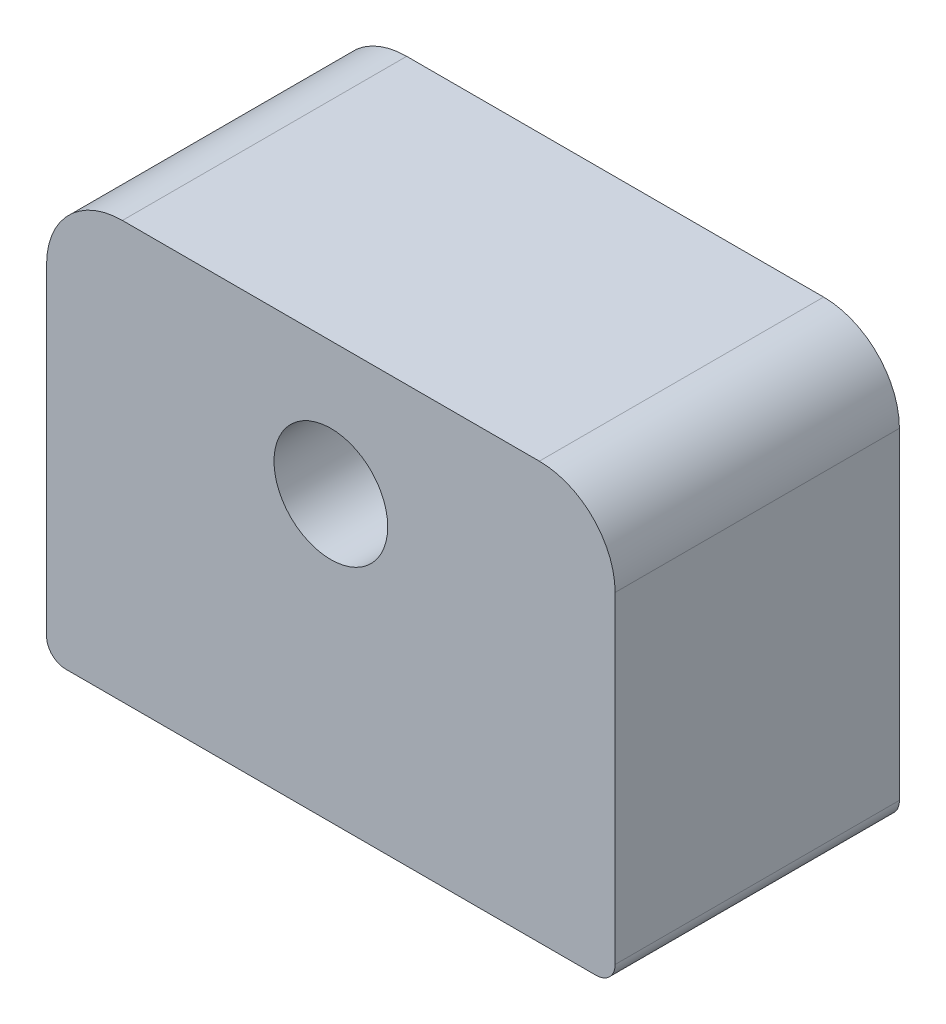
ISO-10303-21;
HEADER;
FILE_DESCRIPTION(('STEP AP214'),'2;1');
FILE_NAME('part.step','',(''),(''),'','','');
FILE_SCHEMA(('AUTOMOTIVE_DESIGN { 1 0 10303 214 1 1 1 1 }'));
ENDSEC;
DATA;
#1=APPLICATION_CONTEXT('core data for automotive mechanical design processes');
#2=APPLICATION_PROTOCOL_DEFINITION('international standard','automotive_design',2000,#1);
#3=PRODUCT_CONTEXT('',#1,'mechanical');
#4=PRODUCT('Part','Part','',(#3));
#5=PRODUCT_RELATED_PRODUCT_CATEGORY('part','',(#4));
#6=PRODUCT_DEFINITION_FORMATION('','',#4);
#7=PRODUCT_DEFINITION_CONTEXT('part definition',#1,'design');
#8=PRODUCT_DEFINITION('design','',#6,#7);
#9=PRODUCT_DEFINITION_SHAPE('','',#8);
#10=(LENGTH_UNIT() NAMED_UNIT(*) SI_UNIT(.MILLI.,.METRE.));
#11=(NAMED_UNIT(*) PLANE_ANGLE_UNIT() SI_UNIT($,.RADIAN.));
#12=(NAMED_UNIT(*) SI_UNIT($,.STERADIAN.) SOLID_ANGLE_UNIT());
#13=UNCERTAINTY_MEASURE_WITH_UNIT(LENGTH_MEASURE(1.E-05),#10,'distance_accuracy_value','');
#14=(GEOMETRIC_REPRESENTATION_CONTEXT(3) GLOBAL_UNCERTAINTY_ASSIGNED_CONTEXT((#13)) GLOBAL_UNIT_ASSIGNED_CONTEXT((#10,
#11,#12)) REPRESENTATION_CONTEXT('',''));
#15=CARTESIAN_POINT('',(0.,0.,0.));
#16=DIRECTION('',(0.,0.,1.));
#17=DIRECTION('',(1.,0.,0.));
#18=AXIS2_PLACEMENT_3D('',#15,#16,#17);
#19=CARTESIAN_POINT('',(-7.5,5.5,7.5));
#20=DIRECTION('',(1.,0.,0.));
#21=DIRECTION('',(0.,0.,-1.));
#22=AXIS2_PLACEMENT_3D('',#19,#20,#21);
#23=PLANE('',#22);
#24=DIRECTION('',(0.,-1.,0.));
#25=VECTOR('',#24,1.);
#26=CARTESIAN_POINT('',(-7.5,5.5,0.));
#27=LINE('',#26,#25);
#28=CARTESIAN_POINT('',(-7.5,3.5,0.));
#29=VERTEX_POINT('',#28);
#30=CARTESIAN_POINT('',(-7.5,-5.,0.));
#31=VERTEX_POINT('',#30);
#32=EDGE_CURVE('E169',#29,#31,#27,.T.);
#33=ORIENTED_EDGE('',*,*,#32,.T.);
#34=DIRECTION('',(0.,0.,-1.));
#35=VECTOR('',#34,1.);
#36=CARTESIAN_POINT('',(-7.5,-5.,7.5));
#37=LINE('',#36,#35);
#38=CARTESIAN_POINT('',(-7.5,-5.,7.5));
#39=VERTEX_POINT('',#38);
#40=EDGE_CURVE('E11',#31,#39,#37,.F.);
#41=ORIENTED_EDGE('',*,*,#40,.T.);
#42=DIRECTION('',(0.,-1.,0.));
#43=VECTOR('',#42,1.);
#44=CARTESIAN_POINT('',(-7.5,5.5,7.5));
#45=LINE('',#44,#43);
#46=CARTESIAN_POINT('',(-7.5,3.5,7.5));
#47=VERTEX_POINT('',#46);
#48=EDGE_CURVE('E124',#47,#39,#45,.T.);
#49=ORIENTED_EDGE('',*,*,#48,.F.);
#50=DIRECTION('',(0.,0.,-1.));
#51=VECTOR('',#50,1.);
#52=CARTESIAN_POINT('',(-7.5,3.5,7.5));
#53=LINE('',#52,#51);
#54=EDGE_CURVE('E140',#47,#29,#53,.T.);
#55=ORIENTED_EDGE('',*,*,#54,.T.);
#56=EDGE_LOOP('',(#33,#41,#49,#55));
#57=FACE_BOUND('',#56,.T.);
#58=ADVANCED_FACE('F32',(#57),#23,.F.);
#59=CARTESIAN_POINT('',(-7.5,-5.5,7.5));
#60=DIRECTION('',(0.,1.,0.));
#61=DIRECTION('',(0.,0.,1.));
#62=AXIS2_PLACEMENT_3D('',#59,#60,#61);
#63=PLANE('',#62);
#64=DIRECTION('',(1.,0.,0.));
#65=VECTOR('',#64,1.);
#66=CARTESIAN_POINT('',(-7.5,-5.5,0.));
#67=LINE('',#66,#65);
#68=CARTESIAN_POINT('',(-7.,-5.5,0.));
#69=VERTEX_POINT('',#68);
#70=CARTESIAN_POINT('',(7.,-5.5,0.));
#71=VERTEX_POINT('',#70);
#72=EDGE_CURVE('E129',#69,#71,#67,.T.);
#73=ORIENTED_EDGE('',*,*,#72,.T.);
#74=DIRECTION('',(0.,0.,-1.));
#75=VECTOR('',#74,1.);
#76=CARTESIAN_POINT('',(7.,-5.5,7.5));
#77=LINE('',#76,#75);
#78=CARTESIAN_POINT('',(7.,-5.5,7.5));
#79=VERTEX_POINT('',#78);
#80=EDGE_CURVE('E53',#71,#79,#77,.F.);
#81=ORIENTED_EDGE('',*,*,#80,.T.);
#82=DIRECTION('',(1.,0.,0.));
#83=VECTOR('',#82,1.);
#84=CARTESIAN_POINT('',(-7.5,-5.5,7.5));
#85=LINE('',#84,#83);
#86=CARTESIAN_POINT('',(-7.,-5.5,7.5));
#87=VERTEX_POINT('',#86);
#88=EDGE_CURVE('E127',#87,#79,#85,.T.);
#89=ORIENTED_EDGE('',*,*,#88,.F.);
#90=DIRECTION('',(0.,0.,-1.));
#91=VECTOR('',#90,1.);
#92=CARTESIAN_POINT('',(-7.,-5.5,7.5));
#93=LINE('',#92,#91);
#94=EDGE_CURVE('E150',#87,#69,#93,.T.);
#95=ORIENTED_EDGE('',*,*,#94,.T.);
#96=EDGE_LOOP('',(#73,#81,#89,#95));
#97=FACE_BOUND('',#96,.T.);
#98=ADVANCED_FACE('F167',(#97),#63,.F.);
#99=CARTESIAN_POINT('',(7.5,5.5,7.5));
#100=DIRECTION('',(-1.,0.,0.));
#101=DIRECTION('',(0.,0.,1.));
#102=AXIS2_PLACEMENT_3D('',#99,#100,#101);
#103=PLANE('',#102);
#104=DIRECTION('',(0.,1.,0.));
#105=VECTOR('',#104,1.);
#106=CARTESIAN_POINT('',(7.5,5.5,7.5));
#107=LINE('',#106,#105);
#108=CARTESIAN_POINT('',(7.5,-5.,7.5));
#109=VERTEX_POINT('',#108);
#110=CARTESIAN_POINT('',(7.5,3.5,7.5));
#111=VERTEX_POINT('',#110);
#112=EDGE_CURVE('E159',#109,#111,#107,.T.);
#113=ORIENTED_EDGE('',*,*,#112,.F.);
#114=DIRECTION('',(0.,0.,-1.));
#115=VECTOR('',#114,1.);
#116=CARTESIAN_POINT('',(7.5,-5.,7.5));
#117=LINE('',#116,#115);
#118=CARTESIAN_POINT('',(7.5,-5.,0.));
#119=VERTEX_POINT('',#118);
#120=EDGE_CURVE('E143',#109,#119,#117,.T.);
#121=ORIENTED_EDGE('',*,*,#120,.T.);
#122=DIRECTION('',(0.,1.,0.));
#123=VECTOR('',#122,1.);
#124=CARTESIAN_POINT('',(7.5,5.5,0.));
#125=LINE('',#124,#123);
#126=CARTESIAN_POINT('',(7.5,3.5,0.));
#127=VERTEX_POINT('',#126);
#128=EDGE_CURVE('E125',#119,#127,#125,.T.);
#129=ORIENTED_EDGE('',*,*,#128,.T.);
#130=DIRECTION('',(0.,0.,-1.));
#131=VECTOR('',#130,1.);
#132=CARTESIAN_POINT('',(7.5,3.5,7.5));
#133=LINE('',#132,#131);
#134=EDGE_CURVE('E106',#127,#111,#133,.F.);
#135=ORIENTED_EDGE('',*,*,#134,.T.);
#136=EDGE_LOOP('',(#113,#121,#129,#135));
#137=FACE_BOUND('',#136,.T.);
#138=ADVANCED_FACE('F163',(#137),#103,.F.);
#139=CARTESIAN_POINT('',(-7.5,5.5,7.5));
#140=DIRECTION('',(0.,-1.,0.));
#141=DIRECTION('',(0.,0.,-1.));
#142=AXIS2_PLACEMENT_3D('',#139,#140,#141);
#143=PLANE('',#142);
#144=DIRECTION('',(-1.,0.,0.));
#145=VECTOR('',#144,1.);
#146=CARTESIAN_POINT('',(-7.5,5.5,7.5));
#147=LINE('',#146,#145);
#148=CARTESIAN_POINT('',(5.5,5.5,7.5));
#149=VERTEX_POINT('',#148);
#150=CARTESIAN_POINT('',(-5.5,5.5,7.5));
#151=VERTEX_POINT('',#150);
#152=EDGE_CURVE('E119',#149,#151,#147,.T.);
#153=ORIENTED_EDGE('',*,*,#152,.F.);
#154=DIRECTION('',(0.,0.,-1.));
#155=VECTOR('',#154,1.);
#156=CARTESIAN_POINT('',(5.5,5.5,7.5));
#157=LINE('',#156,#155);
#158=CARTESIAN_POINT('',(5.5,5.5,0.));
#159=VERTEX_POINT('',#158);
#160=EDGE_CURVE('E104',#149,#159,#157,.T.);
#161=ORIENTED_EDGE('',*,*,#160,.T.);
#162=DIRECTION('',(-1.,0.,0.));
#163=VECTOR('',#162,1.);
#164=CARTESIAN_POINT('',(-7.5,5.5,0.));
#165=LINE('',#164,#163);
#166=CARTESIAN_POINT('',(-5.5,5.5,0.));
#167=VERTEX_POINT('',#166);
#168=EDGE_CURVE('E116',#159,#167,#165,.T.);
#169=ORIENTED_EDGE('',*,*,#168,.T.);
#170=DIRECTION('',(0.,0.,-1.));
#171=VECTOR('',#170,1.);
#172=CARTESIAN_POINT('',(-5.5,5.5,7.5));
#173=LINE('',#172,#171);
#174=EDGE_CURVE('E120',#167,#151,#173,.F.);
#175=ORIENTED_EDGE('',*,*,#174,.T.);
#176=EDGE_LOOP('',(#153,#161,#169,#175));
#177=FACE_BOUND('',#176,.T.);
#178=ADVANCED_FACE('F115',(#177),#143,.F.);
#179=CARTESIAN_POINT('',(0.,0.,7.5));
#180=DIRECTION('',(0.,0.,1.));
#181=DIRECTION('',(1.,0.,0.));
#182=AXIS2_PLACEMENT_3D('',#179,#180,#181);
#183=PLANE('',#182);
#184=CARTESIAN_POINT('',(0.,2.,7.5));
#185=DIRECTION('',(0.,0.,1.));
#186=DIRECTION('',(1.,0.,0.));
#187=AXIS2_PLACEMENT_3D('',#184,#185,#186);
#188=CIRCLE('',#187,1.5);
#189=CARTESIAN_POINT('',(1.5,2.,7.5));
#190=VERTEX_POINT('',#189);
#191=EDGE_CURVE('E175',#190,#190,#188,.T.);
#192=ORIENTED_EDGE('',*,*,#191,.F.);
#193=EDGE_LOOP('',(#192));
#194=FACE_BOUND('',#193,.T.);
#195=ORIENTED_EDGE('',*,*,#88,.T.);
#196=CARTESIAN_POINT('',(7.,-5.,7.5));
#197=DIRECTION('',(0.,0.,1.));
#198=DIRECTION('',(1.,0.,0.));
#199=AXIS2_PLACEMENT_3D('',#196,#197,#198);
#200=CIRCLE('',#199,0.5);
#201=EDGE_CURVE('E40',#79,#109,#200,.T.);
#202=ORIENTED_EDGE('',*,*,#201,.T.);
#203=ORIENTED_EDGE('',*,*,#112,.T.);
#204=CARTESIAN_POINT('',(5.5,3.5,7.5));
#205=DIRECTION('',(0.,0.,1.));
#206=DIRECTION('',(1.,0.,0.));
#207=AXIS2_PLACEMENT_3D('',#204,#205,#206);
#208=CIRCLE('',#207,2.);
#209=EDGE_CURVE('E138',#111,#149,#208,.T.);
#210=ORIENTED_EDGE('',*,*,#209,.T.);
#211=ORIENTED_EDGE('',*,*,#152,.T.);
#212=CARTESIAN_POINT('',(-5.5,3.5,7.5));
#213=DIRECTION('',(0.,0.,1.));
#214=DIRECTION('',(1.,0.,0.));
#215=AXIS2_PLACEMENT_3D('',#212,#213,#214);
#216=CIRCLE('',#215,2.);
#217=EDGE_CURVE('E136',#151,#47,#216,.T.);
#218=ORIENTED_EDGE('',*,*,#217,.T.);
#219=ORIENTED_EDGE('',*,*,#48,.T.);
#220=CARTESIAN_POINT('',(-7.,-5.,7.5));
#221=DIRECTION('',(0.,0.,1.));
#222=DIRECTION('',(1.,0.,0.));
#223=AXIS2_PLACEMENT_3D('',#220,#221,#222);
#224=CIRCLE('',#223,0.5);
#225=EDGE_CURVE('E154',#39,#87,#224,.T.);
#226=ORIENTED_EDGE('',*,*,#225,.T.);
#227=EDGE_LOOP('',(#195,#202,#203,#210,#211,#218,#219,#226));
#228=FACE_BOUND('',#227,.T.);
#229=ADVANCED_FACE('F158',(#194,#228),#183,.T.);
#230=CARTESIAN_POINT('',(0.,0.,0.));
#231=DIRECTION('',(0.,0.,1.));
#232=DIRECTION('',(1.,0.,0.));
#233=AXIS2_PLACEMENT_3D('',#230,#231,#232);
#234=PLANE('',#233);
#235=CARTESIAN_POINT('',(0.,2.,0.));
#236=DIRECTION('',(0.,0.,1.));
#237=DIRECTION('',(1.,0.,0.));
#238=AXIS2_PLACEMENT_3D('',#235,#236,#237);
#239=CIRCLE('',#238,1.5);
#240=CARTESIAN_POINT('',(1.5,2.,0.));
#241=VERTEX_POINT('',#240);
#242=EDGE_CURVE('E170',#241,#241,#239,.T.);
#243=ORIENTED_EDGE('',*,*,#242,.T.);
#244=EDGE_LOOP('',(#243));
#245=FACE_BOUND('',#244,.T.);
#246=ORIENTED_EDGE('',*,*,#128,.F.);
#247=CARTESIAN_POINT('',(7.,-5.,0.));
#248=DIRECTION('',(0.,0.,1.));
#249=DIRECTION('',(1.,0.,0.));
#250=AXIS2_PLACEMENT_3D('',#247,#248,#249);
#251=CIRCLE('',#250,0.5);
#252=EDGE_CURVE('E148',#119,#71,#251,.F.);
#253=ORIENTED_EDGE('',*,*,#252,.T.);
#254=ORIENTED_EDGE('',*,*,#72,.F.);
#255=CARTESIAN_POINT('',(-7.,-5.,0.));
#256=DIRECTION('',(0.,0.,1.));
#257=DIRECTION('',(1.,0.,0.));
#258=AXIS2_PLACEMENT_3D('',#255,#256,#257);
#259=CIRCLE('',#258,0.5);
#260=EDGE_CURVE('E146',#69,#31,#259,.F.);
#261=ORIENTED_EDGE('',*,*,#260,.T.);
#262=ORIENTED_EDGE('',*,*,#32,.F.);
#263=CARTESIAN_POINT('',(-5.5,3.5,0.));
#264=DIRECTION('',(0.,0.,1.));
#265=DIRECTION('',(1.,0.,0.));
#266=AXIS2_PLACEMENT_3D('',#263,#264,#265);
#267=CIRCLE('',#266,2.);
#268=EDGE_CURVE('E110',#29,#167,#267,.F.);
#269=ORIENTED_EDGE('',*,*,#268,.T.);
#270=ORIENTED_EDGE('',*,*,#168,.F.);
#271=CARTESIAN_POINT('',(5.5,3.5,0.));
#272=DIRECTION('',(0.,0.,1.));
#273=DIRECTION('',(1.,0.,0.));
#274=AXIS2_PLACEMENT_3D('',#271,#272,#273);
#275=CIRCLE('',#274,2.);
#276=EDGE_CURVE('E100',#159,#127,#275,.F.);
#277=ORIENTED_EDGE('',*,*,#276,.T.);
#278=EDGE_LOOP('',(#246,#253,#254,#261,#262,#269,#270,#277));
#279=FACE_BOUND('',#278,.T.);
#280=ADVANCED_FACE('F122',(#245,#279),#234,.F.);
#281=CARTESIAN_POINT('',(0.,2.,0.));
#282=DIRECTION('',(0.,0.,1.));
#283=DIRECTION('',(1.,0.,0.));
#284=AXIS2_PLACEMENT_3D('',#281,#282,#283);
#285=CYLINDRICAL_SURFACE('',#284,1.5);
#286=ORIENTED_EDGE('',*,*,#242,.F.);
#287=EDGE_LOOP('',(#286));
#288=FACE_BOUND('',#287,.T.);
#289=ORIENTED_EDGE('',*,*,#191,.T.);
#290=EDGE_LOOP('',(#289));
#291=FACE_BOUND('',#290,.T.);
#292=ADVANCED_FACE('F182',(#288,#291),#285,.F.);
#293=CARTESIAN_POINT('',(5.5,3.5,7.5));
#294=DIRECTION('',(0.,0.,-1.));
#295=DIRECTION('',(-1.,0.,0.));
#296=AXIS2_PLACEMENT_3D('',#293,#294,#295);
#297=CYLINDRICAL_SURFACE('',#296,2.);
#298=ORIENTED_EDGE('',*,*,#209,.F.);
#299=ORIENTED_EDGE('',*,*,#134,.F.);
#300=ORIENTED_EDGE('',*,*,#276,.F.);
#301=ORIENTED_EDGE('',*,*,#160,.F.);
#302=EDGE_LOOP('',(#298,#299,#300,#301));
#303=FACE_BOUND('',#302,.T.);
#304=ADVANCED_FACE('F103',(#303),#297,.T.);
#305=CARTESIAN_POINT('',(-5.5,3.5,7.5));
#306=DIRECTION('',(0.,0.,-1.));
#307=DIRECTION('',(-1.,0.,0.));
#308=AXIS2_PLACEMENT_3D('',#305,#306,#307);
#309=CYLINDRICAL_SURFACE('',#308,2.);
#310=ORIENTED_EDGE('',*,*,#217,.F.);
#311=ORIENTED_EDGE('',*,*,#174,.F.);
#312=ORIENTED_EDGE('',*,*,#268,.F.);
#313=ORIENTED_EDGE('',*,*,#54,.F.);
#314=EDGE_LOOP('',(#310,#311,#312,#313));
#315=FACE_BOUND('',#314,.T.);
#316=ADVANCED_FACE('F206',(#315),#309,.T.);
#317=CARTESIAN_POINT('',(7.,-5.,7.5));
#318=DIRECTION('',(0.,0.,-1.));
#319=DIRECTION('',(-1.,0.,0.));
#320=AXIS2_PLACEMENT_3D('',#317,#318,#319);
#321=CYLINDRICAL_SURFACE('',#320,0.5);
#322=ORIENTED_EDGE('',*,*,#201,.F.);
#323=ORIENTED_EDGE('',*,*,#80,.F.);
#324=ORIENTED_EDGE('',*,*,#252,.F.);
#325=ORIENTED_EDGE('',*,*,#120,.F.);
#326=EDGE_LOOP('',(#322,#323,#324,#325));
#327=FACE_BOUND('',#326,.T.);
#328=ADVANCED_FACE('F165',(#327),#321,.T.);
#329=CARTESIAN_POINT('',(-7.,-5.,7.5));
#330=DIRECTION('',(0.,0.,-1.));
#331=DIRECTION('',(-1.,0.,0.));
#332=AXIS2_PLACEMENT_3D('',#329,#330,#331);
#333=CYLINDRICAL_SURFACE('',#332,0.5);
#334=ORIENTED_EDGE('',*,*,#225,.F.);
#335=ORIENTED_EDGE('',*,*,#40,.F.);
#336=ORIENTED_EDGE('',*,*,#260,.F.);
#337=ORIENTED_EDGE('',*,*,#94,.F.);
#338=EDGE_LOOP('',(#334,#335,#336,#337));
#339=FACE_BOUND('',#338,.T.);
#340=ADVANCED_FACE('F34',(#339),#333,.T.);
#341=CLOSED_SHELL('',(#58,#98,#138,#178,#229,#280,#292,#304,#316,#328,#340));
#342=MANIFOLD_SOLID_BREP('B2',#341);
#343=ADVANCED_BREP_SHAPE_REPRESENTATION('',(#18,#342),#14);
#344=SHAPE_DEFINITION_REPRESENTATION(#9,#343);
ENDSEC;
END-ISO-10303-21;
